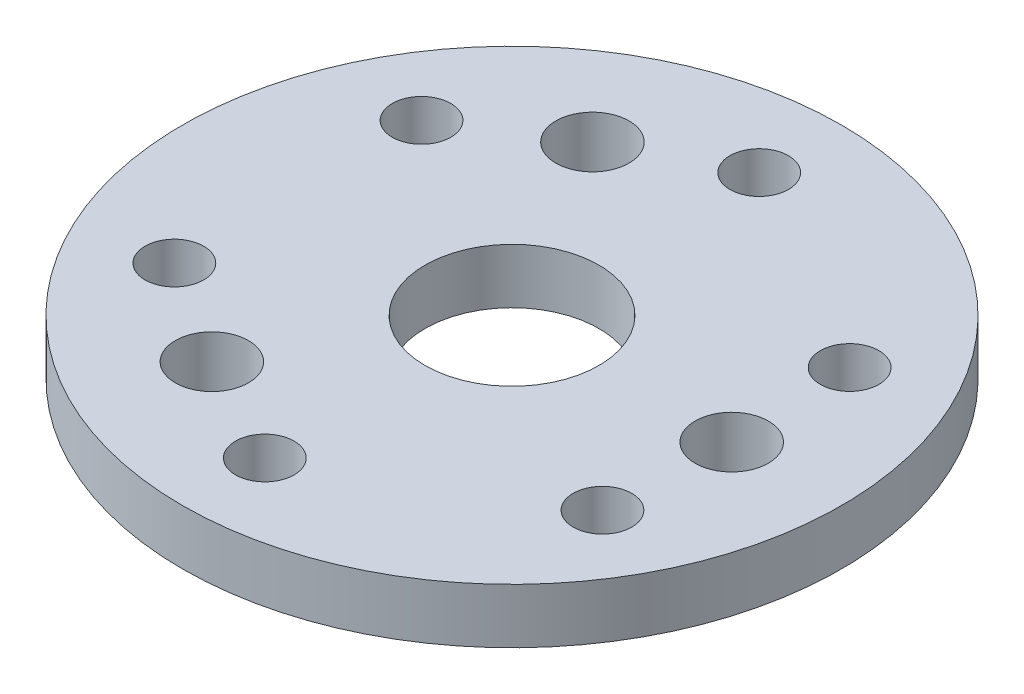
ISO-10303-21;
HEADER;
FILE_DESCRIPTION(('STEP AP214'),'2;1');
FILE_NAME('part.step','',(''),(''),'','','');
FILE_SCHEMA(('AUTOMOTIVE_DESIGN { 1 0 10303 214 1 1 1 1 }'));
ENDSEC;
DATA;
#1=APPLICATION_CONTEXT('core data for automotive mechanical design processes');
#2=APPLICATION_PROTOCOL_DEFINITION('international standard','automotive_design',2000,#1);
#3=PRODUCT_CONTEXT('',#1,'mechanical');
#4=PRODUCT('Part','Part','',(#3));
#5=PRODUCT_RELATED_PRODUCT_CATEGORY('part','',(#4));
#6=PRODUCT_DEFINITION_FORMATION('','',#4);
#7=PRODUCT_DEFINITION_CONTEXT('part definition',#1,'design');
#8=PRODUCT_DEFINITION('design','',#6,#7);
#9=PRODUCT_DEFINITION_SHAPE('','',#8);
#10=(LENGTH_UNIT() NAMED_UNIT(*) SI_UNIT(.MILLI.,.METRE.));
#11=(NAMED_UNIT(*) PLANE_ANGLE_UNIT() SI_UNIT($,.RADIAN.));
#12=(NAMED_UNIT(*) SI_UNIT($,.STERADIAN.) SOLID_ANGLE_UNIT());
#13=UNCERTAINTY_MEASURE_WITH_UNIT(LENGTH_MEASURE(1.E-05),#10,'distance_accuracy_value','');
#14=(GEOMETRIC_REPRESENTATION_CONTEXT(3) GLOBAL_UNCERTAINTY_ASSIGNED_CONTEXT((#13)) GLOBAL_UNIT_ASSIGNED_CONTEXT((#10,
#11,#12)) REPRESENTATION_CONTEXT('',''));
#15=CARTESIAN_POINT('',(0.,0.,0.));
#16=DIRECTION('',(0.,0.,1.));
#17=DIRECTION('',(1.,0.,0.));
#18=AXIS2_PLACEMENT_3D('',#15,#16,#17);
#19=CARTESIAN_POINT('',(0.,3.,0.));
#20=DIRECTION('',(0.,1.,0.));
#21=DIRECTION('',(0.,0.,1.));
#22=AXIS2_PLACEMENT_3D('',#19,#20,#21);
#23=PLANE('',#22);
#24=CARTESIAN_POINT('',(0.,3.,0.));
#25=DIRECTION('',(0.,1.,0.));
#26=DIRECTION('',(0.,0.,1.));
#27=AXIS2_PLACEMENT_3D('',#24,#25,#26);
#28=CIRCLE('',#27,4.75);
#29=CARTESIAN_POINT('',(0.,3.,4.75));
#30=VERTEX_POINT('',#29);
#31=EDGE_CURVE('E107',#30,#30,#28,.T.);
#32=ORIENTED_EDGE('',*,*,#31,.F.);
#33=EDGE_LOOP('',(#32));
#34=FACE_BOUND('',#33,.T.);
#35=CARTESIAN_POINT('',(-6.00000000000005,3.,10.3923048454132));
#36=DIRECTION('',(0.,1.,0.));
#37=DIRECTION('',(0.,0.,1.));
#38=AXIS2_PLACEMENT_3D('',#35,#36,#37);
#39=CIRCLE('',#38,2.);
#40=CARTESIAN_POINT('',(-6.00000000000005,3.,12.3923048454132));
#41=VERTEX_POINT('',#40);
#42=EDGE_CURVE('E93',#41,#41,#39,.T.);
#43=ORIENTED_EDGE('',*,*,#42,.F.);
#44=EDGE_LOOP('',(#43));
#45=FACE_BOUND('',#44,.T.);
#46=CARTESIAN_POINT('',(-11.6913429510898,3.,-6.75000000000014));
#47=DIRECTION('',(0.,1.,0.));
#48=DIRECTION('',(0.,0.,1.));
#49=AXIS2_PLACEMENT_3D('',#46,#47,#48);
#50=CIRCLE('',#49,1.6);
#51=CARTESIAN_POINT('',(-11.6913429510898,3.,-5.15000000000014));
#52=VERTEX_POINT('',#51);
#53=EDGE_CURVE('E81',#52,#52,#50,.T.);
#54=ORIENTED_EDGE('',*,*,#53,.F.);
#55=EDGE_LOOP('',(#54));
#56=FACE_BOUND('',#55,.T.);
#57=CARTESIAN_POINT('',(0.,3.,13.5));
#58=DIRECTION('',(0.,1.,0.));
#59=DIRECTION('',(0.,0.,1.));
#60=AXIS2_PLACEMENT_3D('',#57,#58,#59);
#61=CIRCLE('',#60,1.6);
#62=CARTESIAN_POINT('',(0.,3.,15.1));
#63=VERTEX_POINT('',#62);
#64=EDGE_CURVE('E69',#63,#63,#61,.T.);
#65=ORIENTED_EDGE('',*,*,#64,.F.);
#66=EDGE_LOOP('',(#65));
#67=FACE_BOUND('',#66,.T.);
#68=CARTESIAN_POINT('',(11.6913429510899,3.,-6.74999999999997));
#69=DIRECTION('',(0.,1.,0.));
#70=DIRECTION('',(0.,0.,1.));
#71=AXIS2_PLACEMENT_3D('',#68,#69,#70);
#72=CIRCLE('',#71,1.6);
#73=CARTESIAN_POINT('',(11.6913429510899,3.,-5.14999999999997));
#74=VERTEX_POINT('',#73);
#75=EDGE_CURVE('E57',#74,#74,#72,.T.);
#76=ORIENTED_EDGE('',*,*,#75,.F.);
#77=EDGE_LOOP('',(#76));
#78=FACE_BOUND('',#77,.T.);
#79=CARTESIAN_POINT('',(0.,3.,0.));
#80=DIRECTION('',(0.,1.,0.));
#81=DIRECTION('',(0.,0.,1.));
#82=AXIS2_PLACEMENT_3D('',#79,#80,#81);
#83=CIRCLE('',#82,18.);
#84=CARTESIAN_POINT('',(0.,3.,18.));
#85=VERTEX_POINT('',#84);
#86=EDGE_CURVE('E10',#85,#85,#83,.T.);
#87=ORIENTED_EDGE('',*,*,#86,.T.);
#88=EDGE_LOOP('',(#87));
#89=FACE_BOUND('',#88,.T.);
#90=CARTESIAN_POINT('',(0.,3.,-13.5));
#91=DIRECTION('',(0.,1.,0.));
#92=DIRECTION('',(0.,0.,1.));
#93=AXIS2_PLACEMENT_3D('',#90,#91,#92);
#94=CIRCLE('',#93,1.6);
#95=CARTESIAN_POINT('',(0.,3.,-11.9));
#96=VERTEX_POINT('',#95);
#97=EDGE_CURVE('E52',#96,#96,#94,.T.);
#98=ORIENTED_EDGE('',*,*,#97,.F.);
#99=EDGE_LOOP('',(#98));
#100=FACE_BOUND('',#99,.T.);
#101=CARTESIAN_POINT('',(11.6913429510899,3.,6.75000000000005));
#102=DIRECTION('',(0.,1.,0.));
#103=DIRECTION('',(0.,0.,1.));
#104=AXIS2_PLACEMENT_3D('',#101,#102,#103);
#105=CIRCLE('',#104,1.6);
#106=CARTESIAN_POINT('',(11.6913429510899,3.,8.35000000000006));
#107=VERTEX_POINT('',#106);
#108=EDGE_CURVE('E63',#107,#107,#105,.T.);
#109=ORIENTED_EDGE('',*,*,#108,.F.);
#110=EDGE_LOOP('',(#109));
#111=FACE_BOUND('',#110,.T.);
#112=CARTESIAN_POINT('',(-11.69134295109,3.,6.74999999999989));
#113=DIRECTION('',(0.,1.,0.));
#114=DIRECTION('',(0.,0.,1.));
#115=AXIS2_PLACEMENT_3D('',#112,#113,#114);
#116=CIRCLE('',#115,1.6);
#117=CARTESIAN_POINT('',(-11.69134295109,3.,8.34999999999989));
#118=VERTEX_POINT('',#117);
#119=EDGE_CURVE('E75',#118,#118,#116,.T.);
#120=ORIENTED_EDGE('',*,*,#119,.F.);
#121=EDGE_LOOP('',(#120));
#122=FACE_BOUND('',#121,.T.);
#123=CARTESIAN_POINT('',(12.,3.,0.));
#124=DIRECTION('',(0.,1.,0.));
#125=DIRECTION('',(0.,0.,1.));
#126=AXIS2_PLACEMENT_3D('',#123,#124,#125);
#127=CIRCLE('',#126,2.);
#128=CARTESIAN_POINT('',(12.,3.,2.));
#129=VERTEX_POINT('',#128);
#130=EDGE_CURVE('E87',#129,#129,#127,.T.);
#131=ORIENTED_EDGE('',*,*,#130,.F.);
#132=EDGE_LOOP('',(#131));
#133=FACE_BOUND('',#132,.T.);
#134=CARTESIAN_POINT('',(-5.99999999999991,3.,-10.3923048454133));
#135=DIRECTION('',(0.,1.,0.));
#136=DIRECTION('',(0.,0.,1.));
#137=AXIS2_PLACEMENT_3D('',#134,#135,#136);
#138=CIRCLE('',#137,2.);
#139=CARTESIAN_POINT('',(-5.99999999999991,3.,-8.39230484541332));
#140=VERTEX_POINT('',#139);
#141=EDGE_CURVE('E99',#140,#140,#138,.T.);
#142=ORIENTED_EDGE('',*,*,#141,.F.);
#143=EDGE_LOOP('',(#142));
#144=FACE_BOUND('',#143,.T.);
#145=ADVANCED_FACE('F39',(#34,#45,#56,#67,#78,#89,#100,#111,#122,#133,#144),#23,.T.);
#146=CARTESIAN_POINT('',(0.,0.,0.));
#147=DIRECTION('',(0.,1.,0.));
#148=DIRECTION('',(0.,0.,1.));
#149=AXIS2_PLACEMENT_3D('',#146,#147,#148);
#150=PLANE('',#149);
#151=CARTESIAN_POINT('',(0.,0.,0.));
#152=DIRECTION('',(0.,1.,0.));
#153=DIRECTION('',(0.,0.,1.));
#154=AXIS2_PLACEMENT_3D('',#151,#152,#153);
#155=CIRCLE('',#154,4.75);
#156=CARTESIAN_POINT('',(0.,0.,4.75));
#157=VERTEX_POINT('',#156);
#158=EDGE_CURVE('E43',#157,#157,#155,.T.);
#159=ORIENTED_EDGE('',*,*,#158,.T.);
#160=EDGE_LOOP('',(#159));
#161=FACE_BOUND('',#160,.T.);
#162=CARTESIAN_POINT('',(0.,0.,0.));
#163=DIRECTION('',(0.,1.,0.));
#164=DIRECTION('',(0.,0.,1.));
#165=AXIS2_PLACEMENT_3D('',#162,#163,#164);
#166=CIRCLE('',#165,18.);
#167=CARTESIAN_POINT('',(0.,0.,18.));
#168=VERTEX_POINT('',#167);
#169=EDGE_CURVE('E47',#168,#168,#166,.T.);
#170=ORIENTED_EDGE('',*,*,#169,.F.);
#171=EDGE_LOOP('',(#170));
#172=FACE_BOUND('',#171,.T.);
#173=CARTESIAN_POINT('',(0.,0.,-13.5));
#174=DIRECTION('',(0.,1.,0.));
#175=DIRECTION('',(0.,0.,1.));
#176=AXIS2_PLACEMENT_3D('',#173,#174,#175);
#177=CIRCLE('',#176,1.6);
#178=CARTESIAN_POINT('',(0.,0.,-11.9));
#179=VERTEX_POINT('',#178);
#180=EDGE_CURVE('E54',#179,#179,#177,.T.);
#181=ORIENTED_EDGE('',*,*,#180,.T.);
#182=EDGE_LOOP('',(#181));
#183=FACE_BOUND('',#182,.T.);
#184=CARTESIAN_POINT('',(11.6913429510899,0.,-6.74999999999997));
#185=DIRECTION('',(0.,1.,0.));
#186=DIRECTION('',(0.,0.,1.));
#187=AXIS2_PLACEMENT_3D('',#184,#185,#186);
#188=CIRCLE('',#187,1.6);
#189=CARTESIAN_POINT('',(11.6913429510899,0.,-5.14999999999997));
#190=VERTEX_POINT('',#189);
#191=EDGE_CURVE('E60',#190,#190,#188,.T.);
#192=ORIENTED_EDGE('',*,*,#191,.T.);
#193=EDGE_LOOP('',(#192));
#194=FACE_BOUND('',#193,.T.);
#195=CARTESIAN_POINT('',(11.6913429510899,0.,6.75000000000005));
#196=DIRECTION('',(0.,1.,0.));
#197=DIRECTION('',(0.,0.,1.));
#198=AXIS2_PLACEMENT_3D('',#195,#196,#197);
#199=CIRCLE('',#198,1.6);
#200=CARTESIAN_POINT('',(11.6913429510899,0.,8.35000000000006));
#201=VERTEX_POINT('',#200);
#202=EDGE_CURVE('E66',#201,#201,#199,.T.);
#203=ORIENTED_EDGE('',*,*,#202,.T.);
#204=EDGE_LOOP('',(#203));
#205=FACE_BOUND('',#204,.T.);
#206=CARTESIAN_POINT('',(0.,0.,13.5));
#207=DIRECTION('',(0.,1.,0.));
#208=DIRECTION('',(0.,0.,1.));
#209=AXIS2_PLACEMENT_3D('',#206,#207,#208);
#210=CIRCLE('',#209,1.6);
#211=CARTESIAN_POINT('',(0.,0.,15.1));
#212=VERTEX_POINT('',#211);
#213=EDGE_CURVE('E72',#212,#212,#210,.T.);
#214=ORIENTED_EDGE('',*,*,#213,.T.);
#215=EDGE_LOOP('',(#214));
#216=FACE_BOUND('',#215,.T.);
#217=CARTESIAN_POINT('',(-11.69134295109,0.,6.74999999999989));
#218=DIRECTION('',(0.,1.,0.));
#219=DIRECTION('',(0.,0.,1.));
#220=AXIS2_PLACEMENT_3D('',#217,#218,#219);
#221=CIRCLE('',#220,1.6);
#222=CARTESIAN_POINT('',(-11.69134295109,0.,8.34999999999989));
#223=VERTEX_POINT('',#222);
#224=EDGE_CURVE('E78',#223,#223,#221,.T.);
#225=ORIENTED_EDGE('',*,*,#224,.T.);
#226=EDGE_LOOP('',(#225));
#227=FACE_BOUND('',#226,.T.);
#228=CARTESIAN_POINT('',(-11.6913429510898,0.,-6.75000000000014));
#229=DIRECTION('',(0.,1.,0.));
#230=DIRECTION('',(0.,0.,1.));
#231=AXIS2_PLACEMENT_3D('',#228,#229,#230);
#232=CIRCLE('',#231,1.6);
#233=CARTESIAN_POINT('',(-11.6913429510898,0.,-5.15000000000014));
#234=VERTEX_POINT('',#233);
#235=EDGE_CURVE('E84',#234,#234,#232,.T.);
#236=ORIENTED_EDGE('',*,*,#235,.T.);
#237=EDGE_LOOP('',(#236));
#238=FACE_BOUND('',#237,.T.);
#239=CARTESIAN_POINT('',(12.,0.,0.));
#240=DIRECTION('',(0.,1.,0.));
#241=DIRECTION('',(0.,0.,1.));
#242=AXIS2_PLACEMENT_3D('',#239,#240,#241);
#243=CIRCLE('',#242,2.);
#244=CARTESIAN_POINT('',(12.,0.,2.));
#245=VERTEX_POINT('',#244);
#246=EDGE_CURVE('E90',#245,#245,#243,.T.);
#247=ORIENTED_EDGE('',*,*,#246,.T.);
#248=EDGE_LOOP('',(#247));
#249=FACE_BOUND('',#248,.T.);
#250=CARTESIAN_POINT('',(-6.00000000000005,0.,10.3923048454132));
#251=DIRECTION('',(0.,1.,0.));
#252=DIRECTION('',(0.,0.,1.));
#253=AXIS2_PLACEMENT_3D('',#250,#251,#252);
#254=CIRCLE('',#253,2.);
#255=CARTESIAN_POINT('',(-6.00000000000005,0.,12.3923048454132));
#256=VERTEX_POINT('',#255);
#257=EDGE_CURVE('E96',#256,#256,#254,.T.);
#258=ORIENTED_EDGE('',*,*,#257,.T.);
#259=EDGE_LOOP('',(#258));
#260=FACE_BOUND('',#259,.T.);
#261=CARTESIAN_POINT('',(-5.99999999999991,0.,-10.3923048454133));
#262=DIRECTION('',(0.,1.,0.));
#263=DIRECTION('',(0.,0.,1.));
#264=AXIS2_PLACEMENT_3D('',#261,#262,#263);
#265=CIRCLE('',#264,2.);
#266=CARTESIAN_POINT('',(-5.99999999999991,0.,-8.39230484541332));
#267=VERTEX_POINT('',#266);
#268=EDGE_CURVE('E102',#267,#267,#265,.T.);
#269=ORIENTED_EDGE('',*,*,#268,.T.);
#270=EDGE_LOOP('',(#269));
#271=FACE_BOUND('',#270,.T.);
#272=ADVANCED_FACE('F114',(#161,#172,#183,#194,#205,#216,#227,#238,#249,#260,#271),#150,.F.);
#273=CARTESIAN_POINT('',(0.,3.,0.));
#274=DIRECTION('',(0.,-1.,0.));
#275=DIRECTION('',(0.,0.,-1.));
#276=AXIS2_PLACEMENT_3D('',#273,#274,#275);
#277=CYLINDRICAL_SURFACE('',#276,18.);
#278=ORIENTED_EDGE('',*,*,#86,.F.);
#279=EDGE_LOOP('',(#278));
#280=FACE_BOUND('',#279,.T.);
#281=ORIENTED_EDGE('',*,*,#169,.T.);
#282=EDGE_LOOP('',(#281));
#283=FACE_BOUND('',#282,.T.);
#284=ADVANCED_FACE('F41',(#280,#283),#277,.T.);
#285=CARTESIAN_POINT('',(0.,3.,-13.5));
#286=DIRECTION('',(0.,-1.,0.));
#287=DIRECTION('',(0.,0.,-1.));
#288=AXIS2_PLACEMENT_3D('',#285,#286,#287);
#289=CYLINDRICAL_SURFACE('',#288,1.6);
#290=ORIENTED_EDGE('',*,*,#97,.T.);
#291=EDGE_LOOP('',(#290));
#292=FACE_BOUND('',#291,.T.);
#293=ORIENTED_EDGE('',*,*,#180,.F.);
#294=EDGE_LOOP('',(#293));
#295=FACE_BOUND('',#294,.T.);
#296=ADVANCED_FACE('F135',(#292,#295),#289,.F.);
#297=CARTESIAN_POINT('',(11.6913429510899,3.,-6.74999999999997));
#298=DIRECTION('',(0.,-1.,0.));
#299=DIRECTION('',(0.,0.,-1.));
#300=AXIS2_PLACEMENT_3D('',#297,#298,#299);
#301=CYLINDRICAL_SURFACE('',#300,1.6);
#302=ORIENTED_EDGE('',*,*,#75,.T.);
#303=EDGE_LOOP('',(#302));
#304=FACE_BOUND('',#303,.T.);
#305=ORIENTED_EDGE('',*,*,#191,.F.);
#306=EDGE_LOOP('',(#305));
#307=FACE_BOUND('',#306,.T.);
#308=ADVANCED_FACE('F138',(#304,#307),#301,.F.);
#309=CARTESIAN_POINT('',(11.6913429510899,3.,6.75000000000005));
#310=DIRECTION('',(0.,-1.,0.));
#311=DIRECTION('',(0.,0.,-1.));
#312=AXIS2_PLACEMENT_3D('',#309,#310,#311);
#313=CYLINDRICAL_SURFACE('',#312,1.6);
#314=ORIENTED_EDGE('',*,*,#108,.T.);
#315=EDGE_LOOP('',(#314));
#316=FACE_BOUND('',#315,.T.);
#317=ORIENTED_EDGE('',*,*,#202,.F.);
#318=EDGE_LOOP('',(#317));
#319=FACE_BOUND('',#318,.T.);
#320=ADVANCED_FACE('F142',(#316,#319),#313,.F.);
#321=CARTESIAN_POINT('',(0.,3.,13.5));
#322=DIRECTION('',(0.,-1.,0.));
#323=DIRECTION('',(0.,0.,-1.));
#324=AXIS2_PLACEMENT_3D('',#321,#322,#323);
#325=CYLINDRICAL_SURFACE('',#324,1.6);
#326=ORIENTED_EDGE('',*,*,#64,.T.);
#327=EDGE_LOOP('',(#326));
#328=FACE_BOUND('',#327,.T.);
#329=ORIENTED_EDGE('',*,*,#213,.F.);
#330=EDGE_LOOP('',(#329));
#331=FACE_BOUND('',#330,.T.);
#332=ADVANCED_FACE('F146',(#328,#331),#325,.F.);
#333=CARTESIAN_POINT('',(-11.69134295109,3.,6.74999999999989));
#334=DIRECTION('',(0.,-1.,0.));
#335=DIRECTION('',(0.,0.,-1.));
#336=AXIS2_PLACEMENT_3D('',#333,#334,#335);
#337=CYLINDRICAL_SURFACE('',#336,1.6);
#338=ORIENTED_EDGE('',*,*,#119,.T.);
#339=EDGE_LOOP('',(#338));
#340=FACE_BOUND('',#339,.T.);
#341=ORIENTED_EDGE('',*,*,#224,.F.);
#342=EDGE_LOOP('',(#341));
#343=FACE_BOUND('',#342,.T.);
#344=ADVANCED_FACE('F150',(#340,#343),#337,.F.);
#345=CARTESIAN_POINT('',(-11.6913429510898,3.,-6.75000000000014));
#346=DIRECTION('',(0.,-1.,0.));
#347=DIRECTION('',(0.,0.,-1.));
#348=AXIS2_PLACEMENT_3D('',#345,#346,#347);
#349=CYLINDRICAL_SURFACE('',#348,1.6);
#350=ORIENTED_EDGE('',*,*,#53,.T.);
#351=EDGE_LOOP('',(#350));
#352=FACE_BOUND('',#351,.T.);
#353=ORIENTED_EDGE('',*,*,#235,.F.);
#354=EDGE_LOOP('',(#353));
#355=FACE_BOUND('',#354,.T.);
#356=ADVANCED_FACE('F154',(#352,#355),#349,.F.);
#357=CARTESIAN_POINT('',(12.,3.,0.));
#358=DIRECTION('',(0.,-1.,0.));
#359=DIRECTION('',(0.,0.,-1.));
#360=AXIS2_PLACEMENT_3D('',#357,#358,#359);
#361=CYLINDRICAL_SURFACE('',#360,2.);
#362=ORIENTED_EDGE('',*,*,#130,.T.);
#363=EDGE_LOOP('',(#362));
#364=FACE_BOUND('',#363,.T.);
#365=ORIENTED_EDGE('',*,*,#246,.F.);
#366=EDGE_LOOP('',(#365));
#367=FACE_BOUND('',#366,.T.);
#368=ADVANCED_FACE('F158',(#364,#367),#361,.F.);
#369=CARTESIAN_POINT('',(-6.00000000000005,3.,10.3923048454132));
#370=DIRECTION('',(0.,-1.,0.));
#371=DIRECTION('',(0.,0.,-1.));
#372=AXIS2_PLACEMENT_3D('',#369,#370,#371);
#373=CYLINDRICAL_SURFACE('',#372,2.);
#374=ORIENTED_EDGE('',*,*,#42,.T.);
#375=EDGE_LOOP('',(#374));
#376=FACE_BOUND('',#375,.T.);
#377=ORIENTED_EDGE('',*,*,#257,.F.);
#378=EDGE_LOOP('',(#377));
#379=FACE_BOUND('',#378,.T.);
#380=ADVANCED_FACE('F125',(#376,#379),#373,.F.);
#381=CARTESIAN_POINT('',(-5.99999999999991,3.,-10.3923048454133));
#382=DIRECTION('',(0.,-1.,0.));
#383=DIRECTION('',(0.,0.,-1.));
#384=AXIS2_PLACEMENT_3D('',#381,#382,#383);
#385=CYLINDRICAL_SURFACE('',#384,2.);
#386=ORIENTED_EDGE('',*,*,#141,.T.);
#387=EDGE_LOOP('',(#386));
#388=FACE_BOUND('',#387,.T.);
#389=ORIENTED_EDGE('',*,*,#268,.F.);
#390=EDGE_LOOP('',(#389));
#391=FACE_BOUND('',#390,.T.);
#392=ADVANCED_FACE('F119',(#388,#391),#385,.F.);
#393=CARTESIAN_POINT('',(0.,-1.,0.));
#394=DIRECTION('',(0.,1.,0.));
#395=DIRECTION('',(0.,0.,1.));
#396=AXIS2_PLACEMENT_3D('',#393,#394,#395);
#397=CYLINDRICAL_SURFACE('',#396,4.75);
#398=ORIENTED_EDGE('',*,*,#31,.T.);
#399=EDGE_LOOP('',(#398));
#400=FACE_BOUND('',#399,.T.);
#401=ORIENTED_EDGE('',*,*,#158,.F.);
#402=EDGE_LOOP('',(#401));
#403=FACE_BOUND('',#402,.T.);
#404=ADVANCED_FACE('F117',(#400,#403),#397,.F.);
#405=CLOSED_SHELL('',(#145,#272,#284,#296,#308,#320,#332,#344,#356,#368,#380,#392,#404));
#406=MANIFOLD_SOLID_BREP('B2',#405);
#407=ADVANCED_BREP_SHAPE_REPRESENTATION('',(#18,#406),#14);
#408=SHAPE_DEFINITION_REPRESENTATION(#9,#407);
ENDSEC;
END-ISO-10303-21;
